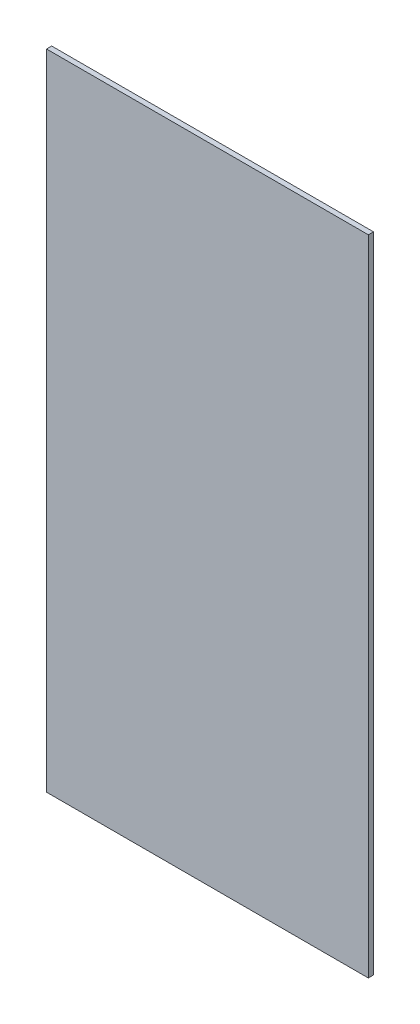
ISO-10303-21;
HEADER;
FILE_DESCRIPTION(('STEP AP214'),'2;1');
FILE_NAME('part.step','',(''),(''),'','','');
FILE_SCHEMA(('AUTOMOTIVE_DESIGN { 1 0 10303 214 1 1 1 1 }'));
ENDSEC;
DATA;
#1=APPLICATION_CONTEXT('core data for automotive mechanical design processes');
#2=APPLICATION_PROTOCOL_DEFINITION('international standard','automotive_design',2000,#1);
#3=PRODUCT_CONTEXT('',#1,'mechanical');
#4=PRODUCT('Part','Part','',(#3));
#5=PRODUCT_RELATED_PRODUCT_CATEGORY('part','',(#4));
#6=PRODUCT_DEFINITION_FORMATION('','',#4);
#7=PRODUCT_DEFINITION_CONTEXT('part definition',#1,'design');
#8=PRODUCT_DEFINITION('design','',#6,#7);
#9=PRODUCT_DEFINITION_SHAPE('','',#8);
#10=(LENGTH_UNIT() NAMED_UNIT(*) SI_UNIT(.MILLI.,.METRE.));
#11=(NAMED_UNIT(*) PLANE_ANGLE_UNIT() SI_UNIT($,.RADIAN.));
#12=(NAMED_UNIT(*) SI_UNIT($,.STERADIAN.) SOLID_ANGLE_UNIT());
#13=UNCERTAINTY_MEASURE_WITH_UNIT(LENGTH_MEASURE(1.E-05),#10,'distance_accuracy_value','');
#14=(GEOMETRIC_REPRESENTATION_CONTEXT(3) GLOBAL_UNCERTAINTY_ASSIGNED_CONTEXT((#13)) GLOBAL_UNIT_ASSIGNED_CONTEXT((#10,
#11,#12)) REPRESENTATION_CONTEXT('',''));
#15=CARTESIAN_POINT('',(0.,0.,0.));
#16=DIRECTION('',(0.,0.,1.));
#17=DIRECTION('',(1.,0.,0.));
#18=AXIS2_PLACEMENT_3D('',#15,#16,#17);
#19=CARTESIAN_POINT('',(125.,250.,4.));
#20=DIRECTION('',(-1.,0.,0.));
#21=DIRECTION('',(0.,-1.,0.));
#22=AXIS2_PLACEMENT_3D('',#19,#20,#21);
#23=PLANE('',#22);
#24=DIRECTION('',(0.,1.,0.));
#25=VECTOR('',#24,1.);
#26=CARTESIAN_POINT('',(125.,250.,0.));
#27=LINE('',#26,#25);
#28=CARTESIAN_POINT('',(125.,-250.,0.));
#29=VERTEX_POINT('',#28);
#30=CARTESIAN_POINT('',(125.,250.,0.));
#31=VERTEX_POINT('',#30);
#32=EDGE_CURVE('E96',#29,#31,#27,.T.);
#33=ORIENTED_EDGE('',*,*,#32,.T.);
#34=DIRECTION('',(0.,0.,-1.));
#35=VECTOR('',#34,1.);
#36=CARTESIAN_POINT('',(125.,250.,4.));
#37=LINE('',#36,#35);
#38=CARTESIAN_POINT('',(125.,250.,4.));
#39=VERTEX_POINT('',#38);
#40=EDGE_CURVE('E11',#39,#31,#37,.T.);
#41=ORIENTED_EDGE('',*,*,#40,.F.);
#42=DIRECTION('',(0.,1.,0.));
#43=VECTOR('',#42,1.);
#44=CARTESIAN_POINT('',(125.,250.,4.));
#45=LINE('',#44,#43);
#46=CARTESIAN_POINT('',(125.,-250.,4.));
#47=VERTEX_POINT('',#46);
#48=EDGE_CURVE('E84',#47,#39,#45,.T.);
#49=ORIENTED_EDGE('',*,*,#48,.F.);
#50=DIRECTION('',(0.,0.,-1.));
#51=VECTOR('',#50,1.);
#52=CARTESIAN_POINT('',(125.,-250.,4.));
#53=LINE('',#52,#51);
#54=EDGE_CURVE('E92',#47,#29,#53,.T.);
#55=ORIENTED_EDGE('',*,*,#54,.T.);
#56=EDGE_LOOP('',(#33,#41,#49,#55));
#57=FACE_BOUND('',#56,.T.);
#58=ADVANCED_FACE('F33',(#57),#23,.F.);
#59=CARTESIAN_POINT('',(-125.,250.,4.));
#60=DIRECTION('',(0.,-1.,0.));
#61=DIRECTION('',(0.,0.,-1.));
#62=AXIS2_PLACEMENT_3D('',#59,#60,#61);
#63=PLANE('',#62);
#64=DIRECTION('',(-1.,0.,0.));
#65=VECTOR('',#64,1.);
#66=CARTESIAN_POINT('',(-125.,250.,0.));
#67=LINE('',#66,#65);
#68=CARTESIAN_POINT('',(-125.,250.,0.));
#69=VERTEX_POINT('',#68);
#70=EDGE_CURVE('E88',#31,#69,#67,.T.);
#71=ORIENTED_EDGE('',*,*,#70,.T.);
#72=DIRECTION('',(0.,0.,-1.));
#73=VECTOR('',#72,1.);
#74=CARTESIAN_POINT('',(-125.,250.,4.));
#75=LINE('',#74,#73);
#76=CARTESIAN_POINT('',(-125.,250.,4.));
#77=VERTEX_POINT('',#76);
#78=EDGE_CURVE('E41',#77,#69,#75,.T.);
#79=ORIENTED_EDGE('',*,*,#78,.F.);
#80=DIRECTION('',(-1.,0.,0.));
#81=VECTOR('',#80,1.);
#82=CARTESIAN_POINT('',(-125.,250.,4.));
#83=LINE('',#82,#81);
#84=EDGE_CURVE('E79',#39,#77,#83,.T.);
#85=ORIENTED_EDGE('',*,*,#84,.F.);
#86=ORIENTED_EDGE('',*,*,#40,.T.);
#87=EDGE_LOOP('',(#71,#79,#85,#86));
#88=FACE_BOUND('',#87,.T.);
#89=ADVANCED_FACE('F87',(#88),#63,.F.);
#90=CARTESIAN_POINT('',(-125.,250.,4.));
#91=DIRECTION('',(1.,0.,0.));
#92=DIRECTION('',(0.,1.,0.));
#93=AXIS2_PLACEMENT_3D('',#90,#91,#92);
#94=PLANE('',#93);
#95=DIRECTION('',(0.,-1.,0.));
#96=VECTOR('',#95,1.);
#97=CARTESIAN_POINT('',(-125.,250.,0.));
#98=LINE('',#97,#96);
#99=CARTESIAN_POINT('',(-125.,-250.,0.));
#100=VERTEX_POINT('',#99);
#101=EDGE_CURVE('E66',#69,#100,#98,.T.);
#102=ORIENTED_EDGE('',*,*,#101,.T.);
#103=DIRECTION('',(0.,0.,-1.));
#104=VECTOR('',#103,1.);
#105=CARTESIAN_POINT('',(-125.,-250.,4.));
#106=LINE('',#105,#104);
#107=CARTESIAN_POINT('',(-125.,-250.,4.));
#108=VERTEX_POINT('',#107);
#109=EDGE_CURVE('E89',#108,#100,#106,.T.);
#110=ORIENTED_EDGE('',*,*,#109,.F.);
#111=DIRECTION('',(0.,-1.,0.));
#112=VECTOR('',#111,1.);
#113=CARTESIAN_POINT('',(-125.,250.,4.));
#114=LINE('',#113,#112);
#115=EDGE_CURVE('E82',#77,#108,#114,.T.);
#116=ORIENTED_EDGE('',*,*,#115,.F.);
#117=ORIENTED_EDGE('',*,*,#78,.T.);
#118=EDGE_LOOP('',(#102,#110,#116,#117));
#119=FACE_BOUND('',#118,.T.);
#120=ADVANCED_FACE('F90',(#119),#94,.F.);
#121=CARTESIAN_POINT('',(-125.,-250.,4.));
#122=DIRECTION('',(0.,1.,0.));
#123=DIRECTION('',(0.,0.,1.));
#124=AXIS2_PLACEMENT_3D('',#121,#122,#123);
#125=PLANE('',#124);
#126=DIRECTION('',(1.,0.,0.));
#127=VECTOR('',#126,1.);
#128=CARTESIAN_POINT('',(-125.,-250.,0.));
#129=LINE('',#128,#127);
#130=EDGE_CURVE('E72',#100,#29,#129,.T.);
#131=ORIENTED_EDGE('',*,*,#130,.T.);
#132=ORIENTED_EDGE('',*,*,#54,.F.);
#133=DIRECTION('',(1.,0.,0.));
#134=VECTOR('',#133,1.);
#135=CARTESIAN_POINT('',(-125.,-250.,4.));
#136=LINE('',#135,#134);
#137=EDGE_CURVE('E49',#108,#47,#136,.T.);
#138=ORIENTED_EDGE('',*,*,#137,.F.);
#139=ORIENTED_EDGE('',*,*,#109,.T.);
#140=EDGE_LOOP('',(#131,#132,#138,#139));
#141=FACE_BOUND('',#140,.T.);
#142=ADVANCED_FACE('F103',(#141),#125,.F.);
#143=CARTESIAN_POINT('',(0.,0.,4.));
#144=DIRECTION('',(0.,0.,1.));
#145=DIRECTION('',(1.,0.,0.));
#146=AXIS2_PLACEMENT_3D('',#143,#144,#145);
#147=PLANE('',#146);
#148=ORIENTED_EDGE('',*,*,#48,.T.);
#149=ORIENTED_EDGE('',*,*,#84,.T.);
#150=ORIENTED_EDGE('',*,*,#115,.T.);
#151=ORIENTED_EDGE('',*,*,#137,.T.);
#152=EDGE_LOOP('',(#148,#149,#150,#151));
#153=FACE_BOUND('',#152,.T.);
#154=ADVANCED_FACE('F80',(#153),#147,.T.);
#155=CARTESIAN_POINT('',(0.,0.,0.));
#156=DIRECTION('',(0.,0.,1.));
#157=DIRECTION('',(1.,0.,0.));
#158=AXIS2_PLACEMENT_3D('',#155,#156,#157);
#159=PLANE('',#158);
#160=ORIENTED_EDGE('',*,*,#32,.F.);
#161=ORIENTED_EDGE('',*,*,#130,.F.);
#162=ORIENTED_EDGE('',*,*,#101,.F.);
#163=ORIENTED_EDGE('',*,*,#70,.F.);
#164=EDGE_LOOP('',(#160,#161,#162,#163));
#165=FACE_BOUND('',#164,.T.);
#166=ADVANCED_FACE('F106',(#165),#159,.F.);
#167=CLOSED_SHELL('',(#58,#89,#120,#142,#154,#166));
#168=MANIFOLD_SOLID_BREP('B2',#167);
#169=ADVANCED_BREP_SHAPE_REPRESENTATION('',(#18,#168),#14);
#170=SHAPE_DEFINITION_REPRESENTATION(#9,#169);
ENDSEC;
END-ISO-10303-21;
